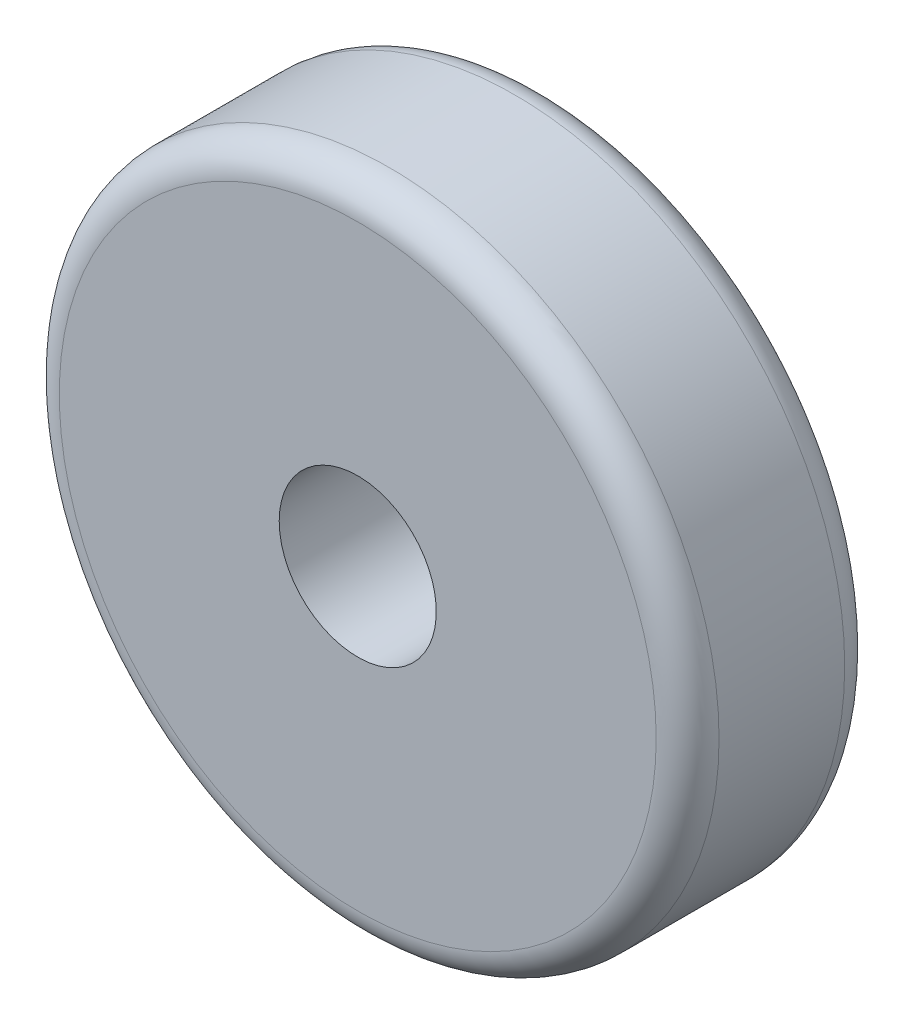
ISO-10303-21;
HEADER;
FILE_DESCRIPTION(('STEP AP214'),'2;1');
FILE_NAME('part.step','',(''),(''),'','','');
FILE_SCHEMA(('AUTOMOTIVE_DESIGN { 1 0 10303 214 1 1 1 1 }'));
ENDSEC;
DATA;
#1=APPLICATION_CONTEXT('core data for automotive mechanical design processes');
#2=APPLICATION_PROTOCOL_DEFINITION('international standard','automotive_design',2000,#1);
#3=PRODUCT_CONTEXT('',#1,'mechanical');
#4=PRODUCT('Part','Part','',(#3));
#5=PRODUCT_RELATED_PRODUCT_CATEGORY('part','',(#4));
#6=PRODUCT_DEFINITION_FORMATION('','',#4);
#7=PRODUCT_DEFINITION_CONTEXT('part definition',#1,'design');
#8=PRODUCT_DEFINITION('design','',#6,#7);
#9=PRODUCT_DEFINITION_SHAPE('','',#8);
#10=(LENGTH_UNIT() NAMED_UNIT(*) SI_UNIT(.MILLI.,.METRE.));
#11=(NAMED_UNIT(*) PLANE_ANGLE_UNIT() SI_UNIT($,.RADIAN.));
#12=(NAMED_UNIT(*) SI_UNIT($,.STERADIAN.) SOLID_ANGLE_UNIT());
#13=UNCERTAINTY_MEASURE_WITH_UNIT(LENGTH_MEASURE(1.E-05),#10,'distance_accuracy_value','');
#14=(GEOMETRIC_REPRESENTATION_CONTEXT(3) GLOBAL_UNCERTAINTY_ASSIGNED_CONTEXT((#13)) GLOBAL_UNIT_ASSIGNED_CONTEXT((#10,
#11,#12)) REPRESENTATION_CONTEXT('',''));
#15=CARTESIAN_POINT('',(0.,0.,0.));
#16=DIRECTION('',(0.,0.,1.));
#17=DIRECTION('',(1.,0.,0.));
#18=AXIS2_PLACEMENT_3D('',#15,#16,#17);
#19=CARTESIAN_POINT('',(0.,0.,6.));
#20=DIRECTION('',(0.,0.,-1.));
#21=DIRECTION('',(-1.,0.,0.));
#22=AXIS2_PLACEMENT_3D('',#19,#20,#21);
#23=CYLINDRICAL_SURFACE('',#22,10.5);
#24=CARTESIAN_POINT('',(0.,0.,5.));
#25=DIRECTION('',(0.,0.,1.));
#26=DIRECTION('',(1.,0.,0.));
#27=AXIS2_PLACEMENT_3D('',#24,#25,#26);
#28=CIRCLE('',#27,10.5);
#29=CARTESIAN_POINT('',(10.5,0.,5.));
#30=VERTEX_POINT('',#29);
#31=EDGE_CURVE('E47',#30,#30,#28,.F.);
#32=ORIENTED_EDGE('',*,*,#31,.T.);
#33=EDGE_LOOP('',(#32));
#34=FACE_BOUND('',#33,.T.);
#35=CARTESIAN_POINT('',(0.,0.,1.));
#36=DIRECTION('',(0.,0.,1.));
#37=DIRECTION('',(1.,0.,0.));
#38=AXIS2_PLACEMENT_3D('',#35,#36,#37);
#39=CIRCLE('',#38,10.5);
#40=CARTESIAN_POINT('',(10.5,0.,1.));
#41=VERTEX_POINT('',#40);
#42=EDGE_CURVE('E346',#41,#41,#39,.T.);
#43=ORIENTED_EDGE('',*,*,#42,.T.);
#44=EDGE_LOOP('',(#43));
#45=FACE_BOUND('',#44,.T.);
#46=ADVANCED_FACE('F38',(#34,#45),#23,.T.);
#47=CARTESIAN_POINT('',(0.,0.,6.));
#48=DIRECTION('',(0.,0.,1.));
#49=DIRECTION('',(1.,0.,0.));
#50=AXIS2_PLACEMENT_3D('',#47,#48,#49);
#51=PLANE('',#50);
#52=CARTESIAN_POINT('',(0.,0.,6.));
#53=DIRECTION('',(0.,0.,1.));
#54=DIRECTION('',(1.,0.,0.));
#55=AXIS2_PLACEMENT_3D('',#52,#53,#54);
#56=CIRCLE('',#55,9.5);
#57=CARTESIAN_POINT('',(9.5,0.,6.));
#58=VERTEX_POINT('',#57);
#59=EDGE_CURVE('E339',#58,#58,#56,.T.);
#60=ORIENTED_EDGE('',*,*,#59,.T.);
#61=EDGE_LOOP('',(#60));
#62=FACE_BOUND('',#61,.T.);
#63=CARTESIAN_POINT('',(0.,0.,6.));
#64=DIRECTION('',(0.,0.,-1.));
#65=DIRECTION('',(-1.,0.,0.));
#66=AXIS2_PLACEMENT_3D('',#63,#64,#65);
#67=CIRCLE('',#66,2.5);
#68=CARTESIAN_POINT('',(-2.5,0.,6.));
#69=VERTEX_POINT('',#68);
#70=EDGE_CURVE('E335',#69,#69,#67,.T.);
#71=ORIENTED_EDGE('',*,*,#70,.T.);
#72=EDGE_LOOP('',(#71));
#73=FACE_BOUND('',#72,.T.);
#74=ADVANCED_FACE('F361',(#62,#73),#51,.T.);
#75=CARTESIAN_POINT('',(0.,0.,0.));
#76=DIRECTION('',(0.,0.,1.));
#77=DIRECTION('',(1.,0.,0.));
#78=AXIS2_PLACEMENT_3D('',#75,#76,#77);
#79=PLANE('',#78);
#80=DIRECTION('',(0.,-1.,0.));
#81=VECTOR('',#80,1.);
#82=CARTESIAN_POINT('',(-0.500000000000002,-3.46410161513775,0.));
#83=LINE('',#82,#81);
#84=CARTESIAN_POINT('',(-0.500000000000002,-3.46410161513775,0.));
#85=VERTEX_POINT('',#84);
#86=CARTESIAN_POINT('',(-0.500000000000002,-8.98610037780571,0.));
#87=VERTEX_POINT('',#86);
#88=EDGE_CURVE('E270',#85,#87,#83,.T.);
#89=ORIENTED_EDGE('',*,*,#88,.F.);
#90=CARTESIAN_POINT('',(0.,0.,0.));
#91=DIRECTION('',(0.,0.,1.));
#92=DIRECTION('',(-1.,0.,0.));
#93=AXIS2_PLACEMENT_3D('',#90,#91,#92);
#94=CIRCLE('',#93,3.5);
#95=CARTESIAN_POINT('',(-3.46410161513775,-0.5,0.));
#96=VERTEX_POINT('',#95);
#97=EDGE_CURVE('E54',#96,#85,#94,.T.);
#98=ORIENTED_EDGE('',*,*,#97,.F.);
#99=DIRECTION('',(1.,0.,0.));
#100=VECTOR('',#99,1.);
#101=CARTESIAN_POINT('',(-3.46410161513775,-0.5,0.));
#102=LINE('',#101,#100);
#103=CARTESIAN_POINT('',(-8.98610037780572,-0.5,0.));
#104=VERTEX_POINT('',#103);
#105=EDGE_CURVE('E255',#104,#96,#102,.T.);
#106=ORIENTED_EDGE('',*,*,#105,.F.);
#107=CARTESIAN_POINT('',(0.,0.,0.));
#108=DIRECTION('',(0.,0.,-1.));
#109=DIRECTION('',(-1.,0.,0.));
#110=AXIS2_PLACEMENT_3D('',#107,#108,#109);
#111=CIRCLE('',#110,9.);
#112=EDGE_CURVE('E274',#87,#104,#111,.T.);
#113=ORIENTED_EDGE('',*,*,#112,.F.);
#114=EDGE_LOOP('',(#89,#98,#106,#113));
#115=FACE_BOUND('',#114,.T.);
#116=DIRECTION('',(-1.,0.,0.));
#117=VECTOR('',#116,1.);
#118=CARTESIAN_POINT('',(8.98610037780571,0.5,0.));
#119=LINE('',#118,#117);
#120=CARTESIAN_POINT('',(8.98610037780571,0.5,0.));
#121=VERTEX_POINT('',#120);
#122=CARTESIAN_POINT('',(3.46410161513775,0.5,0.));
#123=VERTEX_POINT('',#122);
#124=EDGE_CURVE('E228',#121,#123,#119,.T.);
#125=ORIENTED_EDGE('',*,*,#124,.F.);
#126=CARTESIAN_POINT('',(0.,0.,0.));
#127=DIRECTION('',(0.,0.,-1.));
#128=DIRECTION('',(-1.,0.,0.));
#129=AXIS2_PLACEMENT_3D('',#126,#127,#128);
#130=CIRCLE('',#129,9.);
#131=CARTESIAN_POINT('',(0.5,8.98610037780571,0.));
#132=VERTEX_POINT('',#131);
#133=EDGE_CURVE('E62',#132,#121,#130,.T.);
#134=ORIENTED_EDGE('',*,*,#133,.F.);
#135=DIRECTION('',(0.,1.,0.));
#136=VECTOR('',#135,1.);
#137=CARTESIAN_POINT('',(0.5,8.98610037780571,0.));
#138=LINE('',#137,#136);
#139=CARTESIAN_POINT('',(0.499999999999999,3.46410161513775,0.));
#140=VERTEX_POINT('',#139);
#141=EDGE_CURVE('E213',#140,#132,#138,.T.);
#142=ORIENTED_EDGE('',*,*,#141,.F.);
#143=CARTESIAN_POINT('',(0.,0.,0.));
#144=DIRECTION('',(0.,0.,1.));
#145=DIRECTION('',(-1.,0.,0.));
#146=AXIS2_PLACEMENT_3D('',#143,#144,#145);
#147=CIRCLE('',#146,3.5);
#148=EDGE_CURVE('E233',#123,#140,#147,.T.);
#149=ORIENTED_EDGE('',*,*,#148,.F.);
#150=EDGE_LOOP('',(#125,#134,#142,#149));
#151=FACE_BOUND('',#150,.T.);
#152=DIRECTION('',(0.,-1.,0.));
#153=VECTOR('',#152,1.);
#154=CARTESIAN_POINT('',(-0.5,8.98610037780571,0.));
#155=LINE('',#154,#153);
#156=CARTESIAN_POINT('',(-0.5,8.98610037780571,0.));
#157=VERTEX_POINT('',#156);
#158=CARTESIAN_POINT('',(-0.500000000000001,3.46410161513775,0.));
#159=VERTEX_POINT('',#158);
#160=EDGE_CURVE('E192',#157,#159,#155,.T.);
#161=ORIENTED_EDGE('',*,*,#160,.F.);
#162=CARTESIAN_POINT('',(0.,0.,0.));
#163=DIRECTION('',(0.,0.,-1.));
#164=DIRECTION('',(-1.,0.,0.));
#165=AXIS2_PLACEMENT_3D('',#162,#163,#164);
#166=CIRCLE('',#165,9.);
#167=CARTESIAN_POINT('',(-8.98610037780571,0.5,0.));
#168=VERTEX_POINT('',#167);
#169=EDGE_CURVE('E159',#168,#157,#166,.T.);
#170=ORIENTED_EDGE('',*,*,#169,.F.);
#171=DIRECTION('',(-1.,0.,0.));
#172=VECTOR('',#171,1.);
#173=CARTESIAN_POINT('',(-3.46410161513775,0.5,0.));
#174=LINE('',#173,#172);
#175=CARTESIAN_POINT('',(-3.46410161513776,0.5,0.));
#176=VERTEX_POINT('',#175);
#177=EDGE_CURVE('E179',#176,#168,#174,.T.);
#178=ORIENTED_EDGE('',*,*,#177,.F.);
#179=CARTESIAN_POINT('',(0.,0.,0.));
#180=DIRECTION('',(0.,0.,1.));
#181=DIRECTION('',(-1.,0.,0.));
#182=AXIS2_PLACEMENT_3D('',#179,#180,#181);
#183=CIRCLE('',#182,3.5);
#184=EDGE_CURVE('E183',#159,#176,#183,.T.);
#185=ORIENTED_EDGE('',*,*,#184,.F.);
#186=EDGE_LOOP('',(#161,#170,#178,#185));
#187=FACE_BOUND('',#186,.T.);
#188=DIRECTION('',(1.,0.,0.));
#189=VECTOR('',#188,1.);
#190=CARTESIAN_POINT('',(8.98610037780571,-0.5,0.));
#191=LINE('',#190,#189);
#192=CARTESIAN_POINT('',(3.46410161513775,-0.5,0.));
#193=VERTEX_POINT('',#192);
#194=CARTESIAN_POINT('',(8.98610037780572,-0.499999999999997,0.));
#195=VERTEX_POINT('',#194);
#196=EDGE_CURVE('E311',#193,#195,#191,.T.);
#197=ORIENTED_EDGE('',*,*,#196,.F.);
#198=CARTESIAN_POINT('',(0.,0.,0.));
#199=DIRECTION('',(0.,0.,1.));
#200=DIRECTION('',(-1.,0.,0.));
#201=AXIS2_PLACEMENT_3D('',#198,#199,#200);
#202=CIRCLE('',#201,3.5);
#203=CARTESIAN_POINT('',(0.499999999999998,-3.46410161513775,0.));
#204=VERTEX_POINT('',#203);
#205=EDGE_CURVE('E202',#204,#193,#202,.T.);
#206=ORIENTED_EDGE('',*,*,#205,.F.);
#207=DIRECTION('',(0.,1.,0.));
#208=VECTOR('',#207,1.);
#209=CARTESIAN_POINT('',(0.499999999999998,-3.46410161513775,0.));
#210=LINE('',#209,#208);
#211=CARTESIAN_POINT('',(0.499999999999998,-8.98610037780572,0.));
#212=VERTEX_POINT('',#211);
#213=EDGE_CURVE('E296',#212,#204,#210,.T.);
#214=ORIENTED_EDGE('',*,*,#213,.F.);
#215=CARTESIAN_POINT('',(0.,0.,0.));
#216=DIRECTION('',(0.,0.,-1.));
#217=DIRECTION('',(-1.,0.,0.));
#218=AXIS2_PLACEMENT_3D('',#215,#216,#217);
#219=CIRCLE('',#218,9.);
#220=EDGE_CURVE('E315',#195,#212,#219,.T.);
#221=ORIENTED_EDGE('',*,*,#220,.F.);
#222=EDGE_LOOP('',(#197,#206,#214,#221));
#223=FACE_BOUND('',#222,.T.);
#224=CARTESIAN_POINT('',(0.,0.,0.));
#225=DIRECTION('',(0.,0.,1.));
#226=DIRECTION('',(1.,0.,0.));
#227=AXIS2_PLACEMENT_3D('',#224,#225,#226);
#228=CIRCLE('',#227,9.5);
#229=CARTESIAN_POINT('',(9.5,0.,0.));
#230=VERTEX_POINT('',#229);
#231=EDGE_CURVE('E11',#230,#230,#228,.F.);
#232=ORIENTED_EDGE('',*,*,#231,.T.);
#233=EDGE_LOOP('',(#232));
#234=FACE_BOUND('',#233,.T.);
#235=CARTESIAN_POINT('',(0.,0.,0.));
#236=DIRECTION('',(0.,0.,-1.));
#237=DIRECTION('',(-1.,0.,0.));
#238=AXIS2_PLACEMENT_3D('',#235,#236,#237);
#239=CIRCLE('',#238,2.5);
#240=CARTESIAN_POINT('',(-2.5,0.,0.));
#241=VERTEX_POINT('',#240);
#242=EDGE_CURVE('E325',#241,#241,#239,.T.);
#243=ORIENTED_EDGE('',*,*,#242,.F.);
#244=EDGE_LOOP('',(#243));
#245=FACE_BOUND('',#244,.T.);
#246=ADVANCED_FACE('F364',(#115,#151,#187,#223,#234,#245),#79,.F.);
#247=CARTESIAN_POINT('',(0.,0.,6.));
#248=DIRECTION('',(0.,0.,-1.));
#249=DIRECTION('',(-1.,0.,0.));
#250=AXIS2_PLACEMENT_3D('',#247,#248,#249);
#251=CYLINDRICAL_SURFACE('',#250,2.5);
#252=ORIENTED_EDGE('',*,*,#70,.F.);
#253=EDGE_LOOP('',(#252));
#254=FACE_BOUND('',#253,.T.);
#255=ORIENTED_EDGE('',*,*,#242,.T.);
#256=EDGE_LOOP('',(#255));
#257=FACE_BOUND('',#256,.T.);
#258=ADVANCED_FACE('F358',(#254,#257),#251,.F.);
#259=CARTESIAN_POINT('',(0.,0.,5.));
#260=DIRECTION('',(0.,0.,1.));
#261=DIRECTION('',(1.,0.,0.));
#262=AXIS2_PLACEMENT_3D('',#259,#260,#261);
#263=TOROIDAL_SURFACE('',#262,9.5,1.);
#264=ORIENTED_EDGE('',*,*,#31,.F.);
#265=EDGE_LOOP('',(#264));
#266=FACE_BOUND('',#265,.T.);
#267=ORIENTED_EDGE('',*,*,#59,.F.);
#268=EDGE_LOOP('',(#267));
#269=FACE_BOUND('',#268,.T.);
#270=ADVANCED_FACE('F355',(#266,#269),#263,.T.);
#271=CARTESIAN_POINT('',(0.,0.,1.));
#272=DIRECTION('',(0.,0.,1.));
#273=DIRECTION('',(1.,0.,0.));
#274=AXIS2_PLACEMENT_3D('',#271,#272,#273);
#275=TOROIDAL_SURFACE('',#274,9.5,1.);
#276=ORIENTED_EDGE('',*,*,#231,.F.);
#277=EDGE_LOOP('',(#276));
#278=FACE_BOUND('',#277,.T.);
#279=ORIENTED_EDGE('',*,*,#42,.F.);
#280=EDGE_LOOP('',(#279));
#281=FACE_BOUND('',#280,.T.);
#282=ADVANCED_FACE('F40',(#278,#281),#275,.T.);
#283=CARTESIAN_POINT('',(0.,0.,2.));
#284=DIRECTION('',(0.,0.,-1.));
#285=DIRECTION('',(-1.,0.,0.));
#286=AXIS2_PLACEMENT_3D('',#283,#284,#285);
#287=CYLINDRICAL_SURFACE('',#286,3.5);
#288=ORIENTED_EDGE('',*,*,#205,.T.);
#289=DIRECTION('',(0.,0.,-1.));
#290=VECTOR('',#289,1.);
#291=CARTESIAN_POINT('',(3.46410161513775,-0.5,2.));
#292=LINE('',#291,#290);
#293=CARTESIAN_POINT('',(3.46410161513775,-0.5,2.));
#294=VERTEX_POINT('',#293);
#295=EDGE_CURVE('E308',#294,#193,#292,.T.);
#296=ORIENTED_EDGE('',*,*,#295,.F.);
#297=CARTESIAN_POINT('',(0.,0.,2.));
#298=DIRECTION('',(0.,0.,1.));
#299=DIRECTION('',(-1.,0.,0.));
#300=AXIS2_PLACEMENT_3D('',#297,#298,#299);
#301=CIRCLE('',#300,3.5);
#302=CARTESIAN_POINT('',(0.499999999999998,-3.46410161513775,2.));
#303=VERTEX_POINT('',#302);
#304=EDGE_CURVE('E291',#303,#294,#301,.T.);
#305=ORIENTED_EDGE('',*,*,#304,.F.);
#306=DIRECTION('',(0.,0.,-1.));
#307=VECTOR('',#306,1.);
#308=CARTESIAN_POINT('',(0.499999999999998,-3.46410161513775,2.));
#309=LINE('',#308,#307);
#310=EDGE_CURVE('E322',#303,#204,#309,.T.);
#311=ORIENTED_EDGE('',*,*,#310,.T.);
#312=EDGE_LOOP('',(#288,#296,#305,#311));
#313=FACE_BOUND('',#312,.T.);
#314=ADVANCED_FACE('F407',(#313),#287,.T.);
#315=CARTESIAN_POINT('',(0.499999999999998,-3.46410161513775,2.));
#316=DIRECTION('',(-1.,0.,0.));
#317=DIRECTION('',(0.,-1.,0.));
#318=AXIS2_PLACEMENT_3D('',#315,#316,#317);
#319=PLANE('',#318);
#320=ORIENTED_EDGE('',*,*,#213,.T.);
#321=ORIENTED_EDGE('',*,*,#310,.F.);
#322=DIRECTION('',(0.,1.,0.));
#323=VECTOR('',#322,1.);
#324=CARTESIAN_POINT('',(0.499999999999998,-3.46410161513775,2.));
#325=LINE('',#324,#323);
#326=CARTESIAN_POINT('',(0.499999999999998,-8.98610037780572,2.));
#327=VERTEX_POINT('',#326);
#328=EDGE_CURVE('E304',#327,#303,#325,.T.);
#329=ORIENTED_EDGE('',*,*,#328,.F.);
#330=DIRECTION('',(0.,0.,-1.));
#331=VECTOR('',#330,1.);
#332=CARTESIAN_POINT('',(0.499999999999998,-8.98610037780572,2.));
#333=LINE('',#332,#331);
#334=EDGE_CURVE('E326',#327,#212,#333,.T.);
#335=ORIENTED_EDGE('',*,*,#334,.T.);
#336=EDGE_LOOP('',(#320,#321,#329,#335));
#337=FACE_BOUND('',#336,.T.);
#338=ADVANCED_FACE('F413',(#337),#319,.F.);
#339=CARTESIAN_POINT('',(0.,0.,2.));
#340=DIRECTION('',(0.,0.,-1.));
#341=DIRECTION('',(-1.,0.,0.));
#342=AXIS2_PLACEMENT_3D('',#339,#340,#341);
#343=CYLINDRICAL_SURFACE('',#342,9.);
#344=ORIENTED_EDGE('',*,*,#220,.T.);
#345=ORIENTED_EDGE('',*,*,#334,.F.);
#346=CARTESIAN_POINT('',(0.,0.,2.));
#347=DIRECTION('',(0.,0.,-1.));
#348=DIRECTION('',(-1.,0.,0.));
#349=AXIS2_PLACEMENT_3D('',#346,#347,#348);
#350=CIRCLE('',#349,9.);
#351=CARTESIAN_POINT('',(8.98610037780572,-0.499999999999997,2.));
#352=VERTEX_POINT('',#351);
#353=EDGE_CURVE('E300',#352,#327,#350,.T.);
#354=ORIENTED_EDGE('',*,*,#353,.F.);
#355=DIRECTION('',(0.,0.,-1.));
#356=VECTOR('',#355,1.);
#357=CARTESIAN_POINT('',(8.98610037780572,-0.499999999999997,2.));
#358=LINE('',#357,#356);
#359=EDGE_CURVE('E329',#352,#195,#358,.T.);
#360=ORIENTED_EDGE('',*,*,#359,.T.);
#361=EDGE_LOOP('',(#344,#345,#354,#360));
#362=FACE_BOUND('',#361,.T.);
#363=ADVANCED_FACE('F421',(#362),#343,.F.);
#364=CARTESIAN_POINT('',(8.98610037780571,-0.5,2.));
#365=DIRECTION('',(0.,1.,0.));
#366=DIRECTION('',(0.,0.,1.));
#367=AXIS2_PLACEMENT_3D('',#364,#365,#366);
#368=PLANE('',#367);
#369=ORIENTED_EDGE('',*,*,#196,.T.);
#370=ORIENTED_EDGE('',*,*,#359,.F.);
#371=DIRECTION('',(1.,0.,0.));
#372=VECTOR('',#371,1.);
#373=CARTESIAN_POINT('',(8.98610037780571,-0.5,2.));
#374=LINE('',#373,#372);
#375=EDGE_CURVE('E295',#294,#352,#374,.T.);
#376=ORIENTED_EDGE('',*,*,#375,.F.);
#377=ORIENTED_EDGE('',*,*,#295,.T.);
#378=EDGE_LOOP('',(#369,#370,#376,#377));
#379=FACE_BOUND('',#378,.T.);
#380=ADVANCED_FACE('F429',(#379),#368,.F.);
#381=CARTESIAN_POINT('',(0.,0.,2.));
#382=DIRECTION('',(0.,0.,-1.));
#383=DIRECTION('',(-1.,0.,0.));
#384=AXIS2_PLACEMENT_3D('',#381,#382,#383);
#385=PLANE('',#384);
#386=ORIENTED_EDGE('',*,*,#304,.T.);
#387=ORIENTED_EDGE('',*,*,#375,.T.);
#388=ORIENTED_EDGE('',*,*,#353,.T.);
#389=ORIENTED_EDGE('',*,*,#328,.T.);
#390=EDGE_LOOP('',(#386,#387,#388,#389));
#391=FACE_BOUND('',#390,.T.);
#392=ADVANCED_FACE('F437',(#391),#385,.T.);
#393=CARTESIAN_POINT('',(0.,0.,2.));
#394=DIRECTION('',(0.,0.,-1.));
#395=DIRECTION('',(-1.,0.,0.));
#396=AXIS2_PLACEMENT_3D('',#393,#394,#395);
#397=CYLINDRICAL_SURFACE('',#396,9.);
#398=ORIENTED_EDGE('',*,*,#169,.T.);
#399=DIRECTION('',(0.,0.,-1.));
#400=VECTOR('',#399,1.);
#401=CARTESIAN_POINT('',(-0.5,8.98610037780571,2.));
#402=LINE('',#401,#400);
#403=CARTESIAN_POINT('',(-0.5,8.98610037780571,2.));
#404=VERTEX_POINT('',#403);
#405=EDGE_CURVE('E152',#404,#157,#402,.T.);
#406=ORIENTED_EDGE('',*,*,#405,.F.);
#407=CARTESIAN_POINT('',(0.,0.,2.));
#408=DIRECTION('',(0.,0.,-1.));
#409=DIRECTION('',(-1.,0.,0.));
#410=AXIS2_PLACEMENT_3D('',#407,#408,#409);
#411=CIRCLE('',#410,9.);
#412=CARTESIAN_POINT('',(-8.98610037780571,0.5,2.));
#413=VERTEX_POINT('',#412);
#414=EDGE_CURVE('E156',#413,#404,#411,.T.);
#415=ORIENTED_EDGE('',*,*,#414,.F.);
#416=DIRECTION('',(0.,0.,-1.));
#417=VECTOR('',#416,1.);
#418=CARTESIAN_POINT('',(-8.98610037780571,0.5,2.));
#419=LINE('',#418,#417);
#420=EDGE_CURVE('E199',#413,#168,#419,.T.);
#421=ORIENTED_EDGE('',*,*,#420,.T.);
#422=EDGE_LOOP('',(#398,#406,#415,#421));
#423=FACE_BOUND('',#422,.T.);
#424=ADVANCED_FACE('F154',(#423),#397,.F.);
#425=CARTESIAN_POINT('',(-3.46410161513775,0.5,2.));
#426=DIRECTION('',(0.,-1.,0.));
#427=DIRECTION('',(0.,0.,-1.));
#428=AXIS2_PLACEMENT_3D('',#425,#426,#427);
#429=PLANE('',#428);
#430=ORIENTED_EDGE('',*,*,#177,.T.);
#431=ORIENTED_EDGE('',*,*,#420,.F.);
#432=DIRECTION('',(-1.,0.,0.));
#433=VECTOR('',#432,1.);
#434=CARTESIAN_POINT('',(-3.46410161513775,0.5,2.));
#435=LINE('',#434,#433);
#436=CARTESIAN_POINT('',(-3.46410161513776,0.5,2.));
#437=VERTEX_POINT('',#436);
#438=EDGE_CURVE('E165',#437,#413,#435,.T.);
#439=ORIENTED_EDGE('',*,*,#438,.F.);
#440=DIRECTION('',(0.,0.,-1.));
#441=VECTOR('',#440,1.);
#442=CARTESIAN_POINT('',(-3.46410161513776,0.5,2.));
#443=LINE('',#442,#441);
#444=EDGE_CURVE('E203',#437,#176,#443,.T.);
#445=ORIENTED_EDGE('',*,*,#444,.T.);
#446=EDGE_LOOP('',(#430,#431,#439,#445));
#447=FACE_BOUND('',#446,.T.);
#448=ADVANCED_FACE('F452',(#447),#429,.F.);
#449=CARTESIAN_POINT('',(0.,0.,2.));
#450=DIRECTION('',(0.,0.,-1.));
#451=DIRECTION('',(-1.,0.,0.));
#452=AXIS2_PLACEMENT_3D('',#449,#450,#451);
#453=CYLINDRICAL_SURFACE('',#452,3.5);
#454=ORIENTED_EDGE('',*,*,#184,.T.);
#455=ORIENTED_EDGE('',*,*,#444,.F.);
#456=CARTESIAN_POINT('',(0.,0.,2.));
#457=DIRECTION('',(0.,0.,1.));
#458=DIRECTION('',(-1.,0.,0.));
#459=AXIS2_PLACEMENT_3D('',#456,#457,#458);
#460=CIRCLE('',#459,3.5);
#461=CARTESIAN_POINT('',(-0.500000000000001,3.46410161513775,2.));
#462=VERTEX_POINT('',#461);
#463=EDGE_CURVE('E174',#462,#437,#460,.T.);
#464=ORIENTED_EDGE('',*,*,#463,.F.);
#465=DIRECTION('',(0.,0.,-1.));
#466=VECTOR('',#465,1.);
#467=CARTESIAN_POINT('',(-0.500000000000001,3.46410161513775,2.));
#468=LINE('',#467,#466);
#469=EDGE_CURVE('E164',#462,#159,#468,.T.);
#470=ORIENTED_EDGE('',*,*,#469,.T.);
#471=EDGE_LOOP('',(#454,#455,#464,#470));
#472=FACE_BOUND('',#471,.T.);
#473=ADVANCED_FACE('F459',(#472),#453,.T.);
#474=CARTESIAN_POINT('',(-0.5,8.98610037780571,2.));
#475=DIRECTION('',(1.,0.,0.));
#476=DIRECTION('',(0.,1.,0.));
#477=AXIS2_PLACEMENT_3D('',#474,#475,#476);
#478=PLANE('',#477);
#479=ORIENTED_EDGE('',*,*,#160,.T.);
#480=ORIENTED_EDGE('',*,*,#469,.F.);
#481=DIRECTION('',(0.,-1.,0.));
#482=VECTOR('',#481,1.);
#483=CARTESIAN_POINT('',(-0.5,8.98610037780571,2.));
#484=LINE('',#483,#482);
#485=EDGE_CURVE('E168',#404,#462,#484,.T.);
#486=ORIENTED_EDGE('',*,*,#485,.F.);
#487=ORIENTED_EDGE('',*,*,#405,.T.);
#488=EDGE_LOOP('',(#479,#480,#486,#487));
#489=FACE_BOUND('',#488,.T.);
#490=ADVANCED_FACE('F169',(#489),#478,.F.);
#491=CARTESIAN_POINT('',(0.,0.,2.));
#492=DIRECTION('',(0.,0.,-1.));
#493=DIRECTION('',(-1.,0.,0.));
#494=AXIS2_PLACEMENT_3D('',#491,#492,#493);
#495=PLANE('',#494);
#496=ORIENTED_EDGE('',*,*,#414,.T.);
#497=ORIENTED_EDGE('',*,*,#485,.T.);
#498=ORIENTED_EDGE('',*,*,#463,.T.);
#499=ORIENTED_EDGE('',*,*,#438,.T.);
#500=EDGE_LOOP('',(#496,#497,#498,#499));
#501=FACE_BOUND('',#500,.T.);
#502=ADVANCED_FACE('F176',(#501),#495,.T.);
#503=CARTESIAN_POINT('',(0.,0.,2.));
#504=DIRECTION('',(0.,0.,-1.));
#505=DIRECTION('',(-1.,0.,0.));
#506=AXIS2_PLACEMENT_3D('',#503,#504,#505);
#507=CYLINDRICAL_SURFACE('',#506,9.);
#508=ORIENTED_EDGE('',*,*,#133,.T.);
#509=DIRECTION('',(0.,0.,-1.));
#510=VECTOR('',#509,1.);
#511=CARTESIAN_POINT('',(8.98610037780571,0.5,2.));
#512=LINE('',#511,#510);
#513=CARTESIAN_POINT('',(8.98610037780571,0.5,2.));
#514=VERTEX_POINT('',#513);
#515=EDGE_CURVE('E225',#514,#121,#512,.T.);
#516=ORIENTED_EDGE('',*,*,#515,.F.);
#517=CARTESIAN_POINT('',(0.,0.,2.));
#518=DIRECTION('',(0.,0.,-1.));
#519=DIRECTION('',(-1.,0.,0.));
#520=AXIS2_PLACEMENT_3D('',#517,#518,#519);
#521=CIRCLE('',#520,9.);
#522=CARTESIAN_POINT('',(0.5,8.98610037780571,2.));
#523=VERTEX_POINT('',#522);
#524=EDGE_CURVE('E208',#523,#514,#521,.T.);
#525=ORIENTED_EDGE('',*,*,#524,.F.);
#526=DIRECTION('',(0.,0.,-1.));
#527=VECTOR('',#526,1.);
#528=CARTESIAN_POINT('',(0.5,8.98610037780571,2.));
#529=LINE('',#528,#527);
#530=EDGE_CURVE('E193',#523,#132,#529,.T.);
#531=ORIENTED_EDGE('',*,*,#530,.T.);
#532=EDGE_LOOP('',(#508,#516,#525,#531));
#533=FACE_BOUND('',#532,.T.);
#534=ADVANCED_FACE('F480',(#533),#507,.F.);
#535=CARTESIAN_POINT('',(0.5,8.98610037780571,2.));
#536=DIRECTION('',(-1.,0.,0.));
#537=DIRECTION('',(0.,-1.,0.));
#538=AXIS2_PLACEMENT_3D('',#535,#536,#537);
#539=PLANE('',#538);
#540=ORIENTED_EDGE('',*,*,#141,.T.);
#541=ORIENTED_EDGE('',*,*,#530,.F.);
#542=DIRECTION('',(0.,1.,0.));
#543=VECTOR('',#542,1.);
#544=CARTESIAN_POINT('',(0.5,8.98610037780571,2.));
#545=LINE('',#544,#543);
#546=CARTESIAN_POINT('',(0.499999999999999,3.46410161513775,2.));
#547=VERTEX_POINT('',#546);
#548=EDGE_CURVE('E221',#547,#523,#545,.T.);
#549=ORIENTED_EDGE('',*,*,#548,.F.);
#550=DIRECTION('',(0.,0.,-1.));
#551=VECTOR('',#550,1.);
#552=CARTESIAN_POINT('',(0.499999999999999,3.46410161513775,2.));
#553=LINE('',#552,#551);
#554=EDGE_CURVE('E242',#547,#140,#553,.T.);
#555=ORIENTED_EDGE('',*,*,#554,.T.);
#556=EDGE_LOOP('',(#540,#541,#549,#555));
#557=FACE_BOUND('',#556,.T.);
#558=ADVANCED_FACE('F487',(#557),#539,.F.);
#559=CARTESIAN_POINT('',(0.,0.,2.));
#560=DIRECTION('',(0.,0.,-1.));
#561=DIRECTION('',(-1.,0.,0.));
#562=AXIS2_PLACEMENT_3D('',#559,#560,#561);
#563=CYLINDRICAL_SURFACE('',#562,3.5);
#564=ORIENTED_EDGE('',*,*,#148,.T.);
#565=ORIENTED_EDGE('',*,*,#554,.F.);
#566=CARTESIAN_POINT('',(0.,0.,2.));
#567=DIRECTION('',(0.,0.,1.));
#568=DIRECTION('',(-1.,0.,0.));
#569=AXIS2_PLACEMENT_3D('',#566,#567,#568);
#570=CIRCLE('',#569,3.5);
#571=CARTESIAN_POINT('',(3.46410161513775,0.5,2.));
#572=VERTEX_POINT('',#571);
#573=EDGE_CURVE('E217',#572,#547,#570,.T.);
#574=ORIENTED_EDGE('',*,*,#573,.F.);
#575=DIRECTION('',(0.,0.,-1.));
#576=VECTOR('',#575,1.);
#577=CARTESIAN_POINT('',(3.46410161513775,0.5,2.));
#578=LINE('',#577,#576);
#579=EDGE_CURVE('E245',#572,#123,#578,.T.);
#580=ORIENTED_EDGE('',*,*,#579,.T.);
#581=EDGE_LOOP('',(#564,#565,#574,#580));
#582=FACE_BOUND('',#581,.T.);
#583=ADVANCED_FACE('F494',(#582),#563,.T.);
#584=CARTESIAN_POINT('',(8.98610037780571,0.5,2.));
#585=DIRECTION('',(0.,-1.,0.));
#586=DIRECTION('',(0.,0.,-1.));
#587=AXIS2_PLACEMENT_3D('',#584,#585,#586);
#588=PLANE('',#587);
#589=ORIENTED_EDGE('',*,*,#124,.T.);
#590=ORIENTED_EDGE('',*,*,#579,.F.);
#591=DIRECTION('',(-1.,0.,0.));
#592=VECTOR('',#591,1.);
#593=CARTESIAN_POINT('',(8.98610037780571,0.5,2.));
#594=LINE('',#593,#592);
#595=EDGE_CURVE('E212',#514,#572,#594,.T.);
#596=ORIENTED_EDGE('',*,*,#595,.F.);
#597=ORIENTED_EDGE('',*,*,#515,.T.);
#598=EDGE_LOOP('',(#589,#590,#596,#597));
#599=FACE_BOUND('',#598,.T.);
#600=ADVANCED_FACE('F502',(#599),#588,.F.);
#601=CARTESIAN_POINT('',(0.,0.,2.));
#602=DIRECTION('',(0.,0.,-1.));
#603=DIRECTION('',(-1.,0.,0.));
#604=AXIS2_PLACEMENT_3D('',#601,#602,#603);
#605=PLANE('',#604);
#606=ORIENTED_EDGE('',*,*,#524,.T.);
#607=ORIENTED_EDGE('',*,*,#595,.T.);
#608=ORIENTED_EDGE('',*,*,#573,.T.);
#609=ORIENTED_EDGE('',*,*,#548,.T.);
#610=EDGE_LOOP('',(#606,#607,#608,#609));
#611=FACE_BOUND('',#610,.T.);
#612=ADVANCED_FACE('F510',(#611),#605,.T.);
#613=CARTESIAN_POINT('',(0.,0.,2.));
#614=DIRECTION('',(0.,0.,-1.));
#615=DIRECTION('',(-1.,0.,0.));
#616=AXIS2_PLACEMENT_3D('',#613,#614,#615);
#617=CYLINDRICAL_SURFACE('',#616,3.5);
#618=ORIENTED_EDGE('',*,*,#97,.T.);
#619=DIRECTION('',(0.,0.,-1.));
#620=VECTOR('',#619,1.);
#621=CARTESIAN_POINT('',(-0.500000000000002,-3.46410161513775,2.));
#622=LINE('',#621,#620);
#623=CARTESIAN_POINT('',(-0.500000000000002,-3.46410161513775,2.));
#624=VERTEX_POINT('',#623);
#625=EDGE_CURVE('E267',#624,#85,#622,.T.);
#626=ORIENTED_EDGE('',*,*,#625,.F.);
#627=CARTESIAN_POINT('',(0.,0.,2.));
#628=DIRECTION('',(0.,0.,1.));
#629=DIRECTION('',(-1.,0.,0.));
#630=AXIS2_PLACEMENT_3D('',#627,#628,#629);
#631=CIRCLE('',#630,3.5);
#632=CARTESIAN_POINT('',(-3.46410161513775,-0.5,2.));
#633=VERTEX_POINT('',#632);
#634=EDGE_CURVE('E250',#633,#624,#631,.T.);
#635=ORIENTED_EDGE('',*,*,#634,.F.);
#636=DIRECTION('',(0.,0.,-1.));
#637=VECTOR('',#636,1.);
#638=CARTESIAN_POINT('',(-3.46410161513775,-0.5,2.));
#639=LINE('',#638,#637);
#640=EDGE_CURVE('E229',#633,#96,#639,.T.);
#641=ORIENTED_EDGE('',*,*,#640,.T.);
#642=EDGE_LOOP('',(#618,#626,#635,#641));
#643=FACE_BOUND('',#642,.T.);
#644=ADVANCED_FACE('F518',(#643),#617,.T.);
#645=CARTESIAN_POINT('',(-3.46410161513775,-0.5,2.));
#646=DIRECTION('',(0.,1.,0.));
#647=DIRECTION('',(0.,0.,1.));
#648=AXIS2_PLACEMENT_3D('',#645,#646,#647);
#649=PLANE('',#648);
#650=ORIENTED_EDGE('',*,*,#105,.T.);
#651=ORIENTED_EDGE('',*,*,#640,.F.);
#652=DIRECTION('',(1.,0.,0.));
#653=VECTOR('',#652,1.);
#654=CARTESIAN_POINT('',(-3.46410161513775,-0.5,2.));
#655=LINE('',#654,#653);
#656=CARTESIAN_POINT('',(-8.98610037780572,-0.5,2.));
#657=VERTEX_POINT('',#656);
#658=EDGE_CURVE('E263',#657,#633,#655,.T.);
#659=ORIENTED_EDGE('',*,*,#658,.F.);
#660=DIRECTION('',(0.,0.,-1.));
#661=VECTOR('',#660,1.);
#662=CARTESIAN_POINT('',(-8.98610037780572,-0.5,2.));
#663=LINE('',#662,#661);
#664=EDGE_CURVE('E283',#657,#104,#663,.T.);
#665=ORIENTED_EDGE('',*,*,#664,.T.);
#666=EDGE_LOOP('',(#650,#651,#659,#665));
#667=FACE_BOUND('',#666,.T.);
#668=ADVANCED_FACE('F526',(#667),#649,.F.);
#669=CARTESIAN_POINT('',(0.,0.,2.));
#670=DIRECTION('',(0.,0.,-1.));
#671=DIRECTION('',(-1.,0.,0.));
#672=AXIS2_PLACEMENT_3D('',#669,#670,#671);
#673=CYLINDRICAL_SURFACE('',#672,9.);
#674=ORIENTED_EDGE('',*,*,#112,.T.);
#675=ORIENTED_EDGE('',*,*,#664,.F.);
#676=CARTESIAN_POINT('',(0.,0.,2.));
#677=DIRECTION('',(0.,0.,-1.));
#678=DIRECTION('',(-1.,0.,0.));
#679=AXIS2_PLACEMENT_3D('',#676,#677,#678);
#680=CIRCLE('',#679,9.);
#681=CARTESIAN_POINT('',(-0.500000000000002,-8.98610037780571,2.));
#682=VERTEX_POINT('',#681);
#683=EDGE_CURVE('E259',#682,#657,#680,.T.);
#684=ORIENTED_EDGE('',*,*,#683,.F.);
#685=DIRECTION('',(0.,0.,-1.));
#686=VECTOR('',#685,1.);
#687=CARTESIAN_POINT('',(-0.500000000000002,-8.98610037780571,2.));
#688=LINE('',#687,#686);
#689=EDGE_CURVE('E286',#682,#87,#688,.T.);
#690=ORIENTED_EDGE('',*,*,#689,.T.);
#691=EDGE_LOOP('',(#674,#675,#684,#690));
#692=FACE_BOUND('',#691,.T.);
#693=ADVANCED_FACE('F533',(#692),#673,.F.);
#694=CARTESIAN_POINT('',(-0.500000000000002,-3.46410161513775,2.));
#695=DIRECTION('',(1.,0.,0.));
#696=DIRECTION('',(0.,1.,0.));
#697=AXIS2_PLACEMENT_3D('',#694,#695,#696);
#698=PLANE('',#697);
#699=ORIENTED_EDGE('',*,*,#88,.T.);
#700=ORIENTED_EDGE('',*,*,#689,.F.);
#701=DIRECTION('',(0.,-1.,0.));
#702=VECTOR('',#701,1.);
#703=CARTESIAN_POINT('',(-0.500000000000002,-3.46410161513775,2.));
#704=LINE('',#703,#702);
#705=EDGE_CURVE('E254',#624,#682,#704,.T.);
#706=ORIENTED_EDGE('',*,*,#705,.F.);
#707=ORIENTED_EDGE('',*,*,#625,.T.);
#708=EDGE_LOOP('',(#699,#700,#706,#707));
#709=FACE_BOUND('',#708,.T.);
#710=ADVANCED_FACE('F541',(#709),#698,.F.);
#711=CARTESIAN_POINT('',(0.,0.,2.));
#712=DIRECTION('',(0.,0.,-1.));
#713=DIRECTION('',(-1.,0.,0.));
#714=AXIS2_PLACEMENT_3D('',#711,#712,#713);
#715=PLANE('',#714);
#716=ORIENTED_EDGE('',*,*,#634,.T.);
#717=ORIENTED_EDGE('',*,*,#705,.T.);
#718=ORIENTED_EDGE('',*,*,#683,.T.);
#719=ORIENTED_EDGE('',*,*,#658,.T.);
#720=EDGE_LOOP('',(#716,#717,#718,#719));
#721=FACE_BOUND('',#720,.T.);
#722=ADVANCED_FACE('F549',(#721),#715,.T.);
#723=CLOSED_SHELL('',(#46,#74,#246,#258,#270,#282,#314,#338,#363,#380,#392,#424,#448,#473,#490,
#502,#534,#558,#583,#600,#612,#644,#668,#693,#710,#722));
#724=MANIFOLD_SOLID_BREP('B2',#723);
#725=ADVANCED_BREP_SHAPE_REPRESENTATION('',(#18,#724),#14);
#726=SHAPE_DEFINITION_REPRESENTATION(#9,#725);
ENDSEC;
END-ISO-10303-21;
